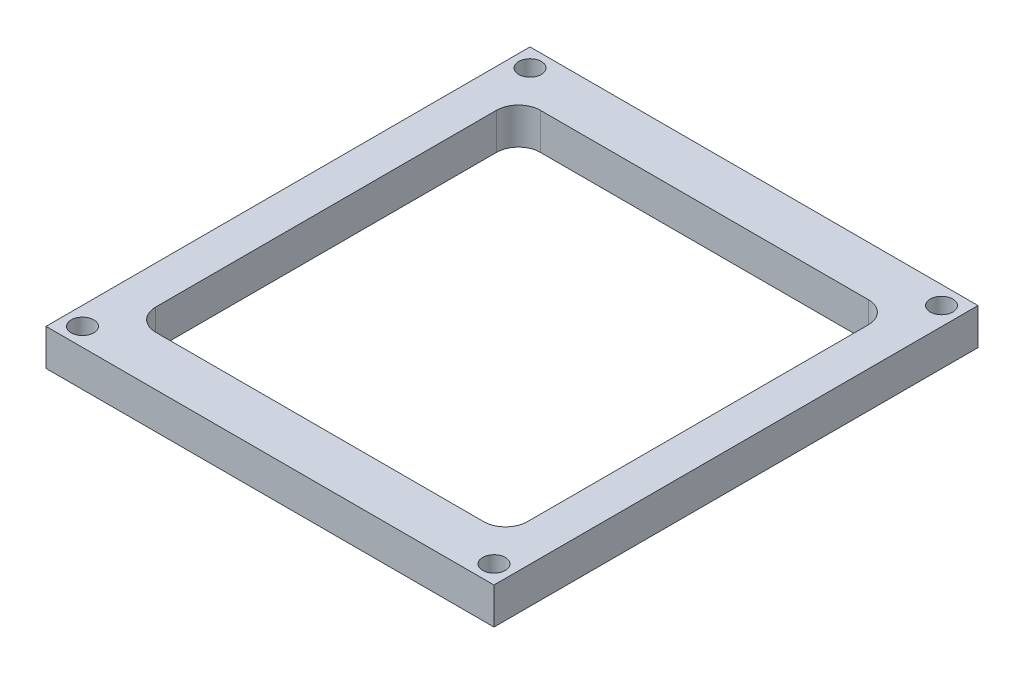
ISO-10303-21;
HEADER;
FILE_DESCRIPTION(('STEP AP214'),'2;1');
FILE_NAME('part.step','',(''),(''),'','','');
FILE_SCHEMA(('AUTOMOTIVE_DESIGN { 1 0 10303 214 1 1 1 1 }'));
ENDSEC;
DATA;
#1=APPLICATION_CONTEXT('core data for automotive mechanical design processes');
#2=APPLICATION_PROTOCOL_DEFINITION('international standard','automotive_design',2000,#1);
#3=PRODUCT_CONTEXT('',#1,'mechanical');
#4=PRODUCT('Part','Part','',(#3));
#5=PRODUCT_RELATED_PRODUCT_CATEGORY('part','',(#4));
#6=PRODUCT_DEFINITION_FORMATION('','',#4);
#7=PRODUCT_DEFINITION_CONTEXT('part definition',#1,'design');
#8=PRODUCT_DEFINITION('design','',#6,#7);
#9=PRODUCT_DEFINITION_SHAPE('','',#8);
#10=(LENGTH_UNIT() NAMED_UNIT(*) SI_UNIT(.MILLI.,.METRE.));
#11=(NAMED_UNIT(*) PLANE_ANGLE_UNIT() SI_UNIT($,.RADIAN.));
#12=(NAMED_UNIT(*) SI_UNIT($,.STERADIAN.) SOLID_ANGLE_UNIT());
#13=UNCERTAINTY_MEASURE_WITH_UNIT(LENGTH_MEASURE(1.E-05),#10,'distance_accuracy_value','');
#14=(GEOMETRIC_REPRESENTATION_CONTEXT(3) GLOBAL_UNCERTAINTY_ASSIGNED_CONTEXT((#13)) GLOBAL_UNIT_ASSIGNED_CONTEXT((#10,
#11,#12)) REPRESENTATION_CONTEXT('',''));
#15=CARTESIAN_POINT('',(0.,0.,0.));
#16=DIRECTION('',(0.,0.,1.));
#17=DIRECTION('',(1.,0.,0.));
#18=AXIS2_PLACEMENT_3D('',#15,#16,#17);
#19=CARTESIAN_POINT('',(0.,5.,0.));
#20=DIRECTION('',(0.,1.,0.));
#21=DIRECTION('',(0.,0.,1.));
#22=AXIS2_PLACEMENT_3D('',#19,#20,#21);
#23=PLANE('',#22);
#24=CARTESIAN_POINT('',(37.919215891535,5.,34.6539286300124));
#25=DIRECTION('',(0.,1.,0.));
#26=DIRECTION('',(0.,0.,1.));
#27=AXIS2_PLACEMENT_3D('',#24,#25,#26);
#28=CIRCLE('',#27,1.54999999999999);
#29=CARTESIAN_POINT('',(37.919215891535,5.,36.2039286300124));
#30=VERTEX_POINT('',#29);
#31=EDGE_CURVE('E199',#30,#30,#28,.T.);
#32=ORIENTED_EDGE('',*,*,#31,.F.);
#33=EDGE_LOOP('',(#32));
#34=FACE_BOUND('',#33,.T.);
#35=CARTESIAN_POINT('',(-18.480784108465,5.,-26.6860713699876));
#36=DIRECTION('',(0.,1.,0.));
#37=DIRECTION('',(0.,0.,1.));
#38=AXIS2_PLACEMENT_3D('',#35,#36,#37);
#39=CIRCLE('',#38,1.55);
#40=CARTESIAN_POINT('',(-18.480784108465,5.,-25.1360713699877));
#41=VERTEX_POINT('',#40);
#42=EDGE_CURVE('E211',#41,#41,#39,.T.);
#43=ORIENTED_EDGE('',*,*,#42,.F.);
#44=EDGE_LOOP('',(#43));
#45=FACE_BOUND('',#44,.T.);
#46=DIRECTION('',(0.,0.,1.));
#47=VECTOR('',#46,1.);
#48=CARTESIAN_POINT('',(-20.980784108465,5.,-29.1860713699876));
#49=LINE('',#48,#47);
#50=CARTESIAN_POINT('',(-20.980784108465,5.,-29.1860713699876));
#51=VERTEX_POINT('',#50);
#52=CARTESIAN_POINT('',(-20.980784108465,5.,37.1539286300124));
#53=VERTEX_POINT('',#52);
#54=EDGE_CURVE('E217',#51,#53,#49,.T.);
#55=ORIENTED_EDGE('',*,*,#54,.T.);
#56=DIRECTION('',(1.,0.,0.));
#57=VECTOR('',#56,1.);
#58=CARTESIAN_POINT('',(-20.980784108465,5.,37.1539286300124));
#59=LINE('',#58,#57);
#60=CARTESIAN_POINT('',(40.419215891535,5.,37.1539286300124));
#61=VERTEX_POINT('',#60);
#62=EDGE_CURVE('E220',#53,#61,#59,.T.);
#63=ORIENTED_EDGE('',*,*,#62,.T.);
#64=DIRECTION('',(0.,0.,-1.));
#65=VECTOR('',#64,1.);
#66=CARTESIAN_POINT('',(40.419215891535,5.,-29.1860713699877));
#67=LINE('',#66,#65);
#68=CARTESIAN_POINT('',(40.419215891535,5.,-29.1860713699877));
#69=VERTEX_POINT('',#68);
#70=EDGE_CURVE('E223',#61,#69,#67,.T.);
#71=ORIENTED_EDGE('',*,*,#70,.T.);
#72=DIRECTION('',(-1.,0.,0.));
#73=VECTOR('',#72,1.);
#74=CARTESIAN_POINT('',(-20.980784108465,5.,-29.1860713699876));
#75=LINE('',#74,#73);
#76=EDGE_CURVE('E225',#69,#51,#75,.T.);
#77=ORIENTED_EDGE('',*,*,#76,.T.);
#78=EDGE_LOOP('',(#55,#63,#71,#77));
#79=FACE_BOUND('',#78,.T.);
#80=CARTESIAN_POINT('',(37.919215891535,5.,-26.6860713699877));
#81=DIRECTION('',(0.,1.,0.));
#82=DIRECTION('',(0.,0.,-1.));
#83=AXIS2_PLACEMENT_3D('',#80,#81,#82);
#84=CIRCLE('',#83,1.54999999999999);
#85=CARTESIAN_POINT('',(37.919215891535,5.,-28.2360713699877));
#86=VERTEX_POINT('',#85);
#87=EDGE_CURVE('E205',#86,#86,#84,.T.);
#88=ORIENTED_EDGE('',*,*,#87,.F.);
#89=EDGE_LOOP('',(#88));
#90=FACE_BOUND('',#89,.T.);
#91=CARTESIAN_POINT('',(-18.480784108465,5.,34.6539286300124));
#92=DIRECTION('',(0.,1.,0.));
#93=DIRECTION('',(0.,0.,-1.));
#94=AXIS2_PLACEMENT_3D('',#91,#92,#93);
#95=CIRCLE('',#94,1.55);
#96=CARTESIAN_POINT('',(-18.480784108465,5.,33.1039286300124));
#97=VERTEX_POINT('',#96);
#98=EDGE_CURVE('E193',#97,#97,#95,.T.);
#99=ORIENTED_EDGE('',*,*,#98,.F.);
#100=EDGE_LOOP('',(#99));
#101=FACE_BOUND('',#100,.T.);
#102=DIRECTION('',(0.,0.,-1.));
#103=VECTOR('',#102,1.);
#104=CARTESIAN_POINT('',(35.194215891535,5.,27.3389286300124));
#105=LINE('',#104,#103);
#106=CARTESIAN_POINT('',(35.194215891535,5.,27.3389286300124));
#107=VERTEX_POINT('',#106);
#108=CARTESIAN_POINT('',(35.194215891535,5.,-19.3710713699876));
#109=VERTEX_POINT('',#108);
#110=EDGE_CURVE('E136',#107,#109,#105,.T.);
#111=ORIENTED_EDGE('',*,*,#110,.F.);
#112=CARTESIAN_POINT('',(32.194215891535,5.,27.3389286300124));
#113=DIRECTION('',(0.,1.,0.));
#114=DIRECTION('',(0.,0.,1.));
#115=AXIS2_PLACEMENT_3D('',#112,#113,#114);
#116=CIRCLE('',#115,3.);
#117=CARTESIAN_POINT('',(32.194215891535,5.,30.3389286300124));
#118=VERTEX_POINT('',#117);
#119=EDGE_CURVE('E128',#118,#107,#116,.T.);
#120=ORIENTED_EDGE('',*,*,#119,.F.);
#121=DIRECTION('',(1.,0.,0.));
#122=VECTOR('',#121,1.);
#123=CARTESIAN_POINT('',(-12.755784108465,5.,30.3389286300124));
#124=LINE('',#123,#122);
#125=CARTESIAN_POINT('',(-12.755784108465,5.,30.3389286300124));
#126=VERTEX_POINT('',#125);
#127=EDGE_CURVE('E161',#126,#118,#124,.T.);
#128=ORIENTED_EDGE('',*,*,#127,.F.);
#129=CARTESIAN_POINT('',(-12.755784108465,5.,27.3389286300124));
#130=DIRECTION('',(0.,1.,0.));
#131=DIRECTION('',(0.,0.,-1.));
#132=AXIS2_PLACEMENT_3D('',#129,#130,#131);
#133=CIRCLE('',#132,3.);
#134=CARTESIAN_POINT('',(-15.755784108465,5.,27.3389286300124));
#135=VERTEX_POINT('',#134);
#136=EDGE_CURVE('E159',#135,#126,#133,.T.);
#137=ORIENTED_EDGE('',*,*,#136,.F.);
#138=DIRECTION('',(0.,0.,1.));
#139=VECTOR('',#138,1.);
#140=CARTESIAN_POINT('',(-15.755784108465,5.,27.3389286300124));
#141=LINE('',#140,#139);
#142=CARTESIAN_POINT('',(-15.755784108465,5.,-19.3710713699876));
#143=VERTEX_POINT('',#142);
#144=EDGE_CURVE('E157',#143,#135,#141,.T.);
#145=ORIENTED_EDGE('',*,*,#144,.F.);
#146=CARTESIAN_POINT('',(-12.755784108465,5.,-19.3710713699876));
#147=DIRECTION('',(0.,1.,0.));
#148=DIRECTION('',(0.,0.,-1.));
#149=AXIS2_PLACEMENT_3D('',#146,#147,#148);
#150=CIRCLE('',#149,3.);
#151=CARTESIAN_POINT('',(-12.755784108465,5.,-22.3710713699876));
#152=VERTEX_POINT('',#151);
#153=EDGE_CURVE('E155',#152,#143,#150,.T.);
#154=ORIENTED_EDGE('',*,*,#153,.F.);
#155=DIRECTION('',(-1.,0.,0.));
#156=VECTOR('',#155,1.);
#157=CARTESIAN_POINT('',(-12.755784108465,5.,-22.3710713699876));
#158=LINE('',#157,#156);
#159=CARTESIAN_POINT('',(32.194215891535,5.,-22.3710713699876));
#160=VERTEX_POINT('',#159);
#161=EDGE_CURVE('E151',#160,#152,#158,.T.);
#162=ORIENTED_EDGE('',*,*,#161,.F.);
#163=CARTESIAN_POINT('',(32.194215891535,5.,-19.3710713699876));
#164=DIRECTION('',(0.,1.,0.));
#165=DIRECTION('',(0.,0.,-1.));
#166=AXIS2_PLACEMENT_3D('',#163,#164,#165);
#167=CIRCLE('',#166,3.);
#168=EDGE_CURVE('E149',#109,#160,#167,.T.);
#169=ORIENTED_EDGE('',*,*,#168,.F.);
#170=EDGE_LOOP('',(#111,#120,#128,#137,#145,#154,#162,#169));
#171=FACE_BOUND('',#170,.T.);
#172=ADVANCED_FACE('F39',(#34,#45,#79,#90,#101,#171),#23,.T.);
#173=CARTESIAN_POINT('',(0.,0.,0.));
#174=DIRECTION('',(0.,1.,0.));
#175=DIRECTION('',(0.,0.,1.));
#176=AXIS2_PLACEMENT_3D('',#173,#174,#175);
#177=PLANE('',#176);
#178=CARTESIAN_POINT('',(-18.480784108465,0.,34.6539286300124));
#179=DIRECTION('',(0.,1.,0.));
#180=DIRECTION('',(0.,0.,-1.));
#181=AXIS2_PLACEMENT_3D('',#178,#179,#180);
#182=CIRCLE('',#181,1.55);
#183=CARTESIAN_POINT('',(-18.480784108465,0.,33.1039286300124));
#184=VERTEX_POINT('',#183);
#185=EDGE_CURVE('E144',#184,#184,#182,.T.);
#186=ORIENTED_EDGE('',*,*,#185,.T.);
#187=EDGE_LOOP('',(#186));
#188=FACE_BOUND('',#187,.T.);
#189=CARTESIAN_POINT('',(37.919215891535,0.,34.6539286300124));
#190=DIRECTION('',(0.,1.,0.));
#191=DIRECTION('',(0.,0.,1.));
#192=AXIS2_PLACEMENT_3D('',#189,#190,#191);
#193=CIRCLE('',#192,1.54999999999999);
#194=CARTESIAN_POINT('',(37.919215891535,0.,36.2039286300124));
#195=VERTEX_POINT('',#194);
#196=EDGE_CURVE('E196',#195,#195,#193,.T.);
#197=ORIENTED_EDGE('',*,*,#196,.T.);
#198=EDGE_LOOP('',(#197));
#199=FACE_BOUND('',#198,.T.);
#200=CARTESIAN_POINT('',(37.919215891535,0.,-26.6860713699877));
#201=DIRECTION('',(0.,1.,0.));
#202=DIRECTION('',(0.,0.,-1.));
#203=AXIS2_PLACEMENT_3D('',#200,#201,#202);
#204=CIRCLE('',#203,1.54999999999999);
#205=CARTESIAN_POINT('',(37.919215891535,0.,-28.2360713699877));
#206=VERTEX_POINT('',#205);
#207=EDGE_CURVE('E202',#206,#206,#204,.T.);
#208=ORIENTED_EDGE('',*,*,#207,.T.);
#209=EDGE_LOOP('',(#208));
#210=FACE_BOUND('',#209,.T.);
#211=CARTESIAN_POINT('',(-18.480784108465,0.,-26.6860713699876));
#212=DIRECTION('',(0.,1.,0.));
#213=DIRECTION('',(0.,0.,1.));
#214=AXIS2_PLACEMENT_3D('',#211,#212,#213);
#215=CIRCLE('',#214,1.55);
#216=CARTESIAN_POINT('',(-18.480784108465,0.,-25.1360713699877));
#217=VERTEX_POINT('',#216);
#218=EDGE_CURVE('E208',#217,#217,#215,.T.);
#219=ORIENTED_EDGE('',*,*,#218,.T.);
#220=EDGE_LOOP('',(#219));
#221=FACE_BOUND('',#220,.T.);
#222=DIRECTION('',(0.,0.,1.));
#223=VECTOR('',#222,1.);
#224=CARTESIAN_POINT('',(-20.980784108465,0.,-29.1860713699876));
#225=LINE('',#224,#223);
#226=CARTESIAN_POINT('',(-20.980784108465,0.,-29.1860713699876));
#227=VERTEX_POINT('',#226);
#228=CARTESIAN_POINT('',(-20.980784108465,0.,37.1539286300124));
#229=VERTEX_POINT('',#228);
#230=EDGE_CURVE('E214',#227,#229,#225,.T.);
#231=ORIENTED_EDGE('',*,*,#230,.F.);
#232=DIRECTION('',(-1.,0.,0.));
#233=VECTOR('',#232,1.);
#234=CARTESIAN_POINT('',(-20.980784108465,0.,-29.1860713699876));
#235=LINE('',#234,#233);
#236=CARTESIAN_POINT('',(40.419215891535,0.,-29.1860713699877));
#237=VERTEX_POINT('',#236);
#238=EDGE_CURVE('E221',#237,#227,#235,.T.);
#239=ORIENTED_EDGE('',*,*,#238,.F.);
#240=DIRECTION('',(0.,0.,-1.));
#241=VECTOR('',#240,1.);
#242=CARTESIAN_POINT('',(40.419215891535,0.,-29.1860713699877));
#243=LINE('',#242,#241);
#244=CARTESIAN_POINT('',(40.419215891535,0.,37.1539286300124));
#245=VERTEX_POINT('',#244);
#246=EDGE_CURVE('E232',#245,#237,#243,.T.);
#247=ORIENTED_EDGE('',*,*,#246,.F.);
#248=DIRECTION('',(1.,0.,0.));
#249=VECTOR('',#248,1.);
#250=CARTESIAN_POINT('',(-20.980784108465,0.,37.1539286300124));
#251=LINE('',#250,#249);
#252=EDGE_CURVE('E230',#229,#245,#251,.T.);
#253=ORIENTED_EDGE('',*,*,#252,.F.);
#254=EDGE_LOOP('',(#231,#239,#247,#253));
#255=FACE_BOUND('',#254,.T.);
#256=CARTESIAN_POINT('',(32.194215891535,0.,27.3389286300124));
#257=DIRECTION('',(0.,1.,0.));
#258=DIRECTION('',(0.,0.,1.));
#259=AXIS2_PLACEMENT_3D('',#256,#257,#258);
#260=CIRCLE('',#259,3.);
#261=CARTESIAN_POINT('',(32.194215891535,0.,30.3389286300124));
#262=VERTEX_POINT('',#261);
#263=CARTESIAN_POINT('',(35.194215891535,0.,27.3389286300124));
#264=VERTEX_POINT('',#263);
#265=EDGE_CURVE('E62',#262,#264,#260,.T.);
#266=ORIENTED_EDGE('',*,*,#265,.T.);
#267=DIRECTION('',(0.,0.,-1.));
#268=VECTOR('',#267,1.);
#269=CARTESIAN_POINT('',(35.194215891535,0.,27.3389286300124));
#270=LINE('',#269,#268);
#271=CARTESIAN_POINT('',(35.194215891535,0.,-19.3710713699876));
#272=VERTEX_POINT('',#271);
#273=EDGE_CURVE('E143',#264,#272,#270,.T.);
#274=ORIENTED_EDGE('',*,*,#273,.T.);
#275=CARTESIAN_POINT('',(32.194215891535,0.,-19.3710713699876));
#276=DIRECTION('',(0.,1.,0.));
#277=DIRECTION('',(0.,0.,-1.));
#278=AXIS2_PLACEMENT_3D('',#275,#276,#277);
#279=CIRCLE('',#278,3.);
#280=CARTESIAN_POINT('',(32.194215891535,0.,-22.3710713699876));
#281=VERTEX_POINT('',#280);
#282=EDGE_CURVE('E165',#272,#281,#279,.T.);
#283=ORIENTED_EDGE('',*,*,#282,.T.);
#284=DIRECTION('',(-1.,0.,0.));
#285=VECTOR('',#284,1.);
#286=CARTESIAN_POINT('',(-12.755784108465,0.,-22.3710713699876));
#287=LINE('',#286,#285);
#288=CARTESIAN_POINT('',(-12.755784108465,0.,-22.3710713699876));
#289=VERTEX_POINT('',#288);
#290=EDGE_CURVE('E168',#281,#289,#287,.T.);
#291=ORIENTED_EDGE('',*,*,#290,.T.);
#292=CARTESIAN_POINT('',(-12.755784108465,0.,-19.3710713699876));
#293=DIRECTION('',(0.,1.,0.));
#294=DIRECTION('',(0.,0.,-1.));
#295=AXIS2_PLACEMENT_3D('',#292,#293,#294);
#296=CIRCLE('',#295,3.);
#297=CARTESIAN_POINT('',(-15.755784108465,0.,-19.3710713699876));
#298=VERTEX_POINT('',#297);
#299=EDGE_CURVE('E171',#289,#298,#296,.T.);
#300=ORIENTED_EDGE('',*,*,#299,.T.);
#301=DIRECTION('',(0.,0.,1.));
#302=VECTOR('',#301,1.);
#303=CARTESIAN_POINT('',(-15.755784108465,0.,27.3389286300124));
#304=LINE('',#303,#302);
#305=CARTESIAN_POINT('',(-15.755784108465,0.,27.3389286300124));
#306=VERTEX_POINT('',#305);
#307=EDGE_CURVE('E174',#298,#306,#304,.T.);
#308=ORIENTED_EDGE('',*,*,#307,.T.);
#309=CARTESIAN_POINT('',(-12.755784108465,0.,27.3389286300124));
#310=DIRECTION('',(0.,1.,0.));
#311=DIRECTION('',(0.,0.,-1.));
#312=AXIS2_PLACEMENT_3D('',#309,#310,#311);
#313=CIRCLE('',#312,3.);
#314=CARTESIAN_POINT('',(-12.755784108465,0.,30.3389286300124));
#315=VERTEX_POINT('',#314);
#316=EDGE_CURVE('E177',#306,#315,#313,.T.);
#317=ORIENTED_EDGE('',*,*,#316,.T.);
#318=DIRECTION('',(1.,0.,0.));
#319=VECTOR('',#318,1.);
#320=CARTESIAN_POINT('',(-12.755784108465,0.,30.3389286300124));
#321=LINE('',#320,#319);
#322=EDGE_CURVE('E137',#315,#262,#321,.T.);
#323=ORIENTED_EDGE('',*,*,#322,.T.);
#324=EDGE_LOOP('',(#266,#274,#283,#291,#300,#308,#317,#323));
#325=FACE_BOUND('',#324,.T.);
#326=ADVANCED_FACE('F250',(#188,#199,#210,#221,#255,#325),#177,.F.);
#327=CARTESIAN_POINT('',(-20.980784108465,5.,-29.1860713699876));
#328=DIRECTION('',(1.,0.,0.));
#329=DIRECTION('',(0.,0.,-1.));
#330=AXIS2_PLACEMENT_3D('',#327,#328,#329);
#331=PLANE('',#330);
#332=ORIENTED_EDGE('',*,*,#230,.T.);
#333=DIRECTION('',(0.,-1.,0.));
#334=VECTOR('',#333,1.);
#335=CARTESIAN_POINT('',(-20.980784108465,5.,37.1539286300124));
#336=LINE('',#335,#334);
#337=EDGE_CURVE('E11',#53,#229,#336,.T.);
#338=ORIENTED_EDGE('',*,*,#337,.F.);
#339=ORIENTED_EDGE('',*,*,#54,.F.);
#340=DIRECTION('',(0.,-1.,0.));
#341=VECTOR('',#340,1.);
#342=CARTESIAN_POINT('',(-20.980784108465,5.,-29.1860713699876));
#343=LINE('',#342,#341);
#344=EDGE_CURVE('E227',#51,#227,#343,.T.);
#345=ORIENTED_EDGE('',*,*,#344,.T.);
#346=EDGE_LOOP('',(#332,#338,#339,#345));
#347=FACE_BOUND('',#346,.T.);
#348=ADVANCED_FACE('F41',(#347),#331,.F.);
#349=CARTESIAN_POINT('',(-20.980784108465,5.,37.1539286300124));
#350=DIRECTION('',(0.,0.,-1.));
#351=DIRECTION('',(-1.,0.,0.));
#352=AXIS2_PLACEMENT_3D('',#349,#350,#351);
#353=PLANE('',#352);
#354=ORIENTED_EDGE('',*,*,#252,.T.);
#355=DIRECTION('',(0.,-1.,0.));
#356=VECTOR('',#355,1.);
#357=CARTESIAN_POINT('',(40.419215891535,5.,37.1539286300124));
#358=LINE('',#357,#356);
#359=EDGE_CURVE('E47',#61,#245,#358,.T.);
#360=ORIENTED_EDGE('',*,*,#359,.F.);
#361=ORIENTED_EDGE('',*,*,#62,.F.);
#362=ORIENTED_EDGE('',*,*,#337,.T.);
#363=EDGE_LOOP('',(#354,#360,#361,#362));
#364=FACE_BOUND('',#363,.T.);
#365=ADVANCED_FACE('F261',(#364),#353,.F.);
#366=CARTESIAN_POINT('',(40.419215891535,5.,-29.1860713699877));
#367=DIRECTION('',(-1.,0.,0.));
#368=DIRECTION('',(0.,0.,1.));
#369=AXIS2_PLACEMENT_3D('',#366,#367,#368);
#370=PLANE('',#369);
#371=ORIENTED_EDGE('',*,*,#246,.T.);
#372=DIRECTION('',(0.,-1.,0.));
#373=VECTOR('',#372,1.);
#374=CARTESIAN_POINT('',(40.419215891535,5.,-29.1860713699877));
#375=LINE('',#374,#373);
#376=EDGE_CURVE('E237',#69,#237,#375,.T.);
#377=ORIENTED_EDGE('',*,*,#376,.F.);
#378=ORIENTED_EDGE('',*,*,#70,.F.);
#379=ORIENTED_EDGE('',*,*,#359,.T.);
#380=EDGE_LOOP('',(#371,#377,#378,#379));
#381=FACE_BOUND('',#380,.T.);
#382=ADVANCED_FACE('F244',(#381),#370,.F.);
#383=CARTESIAN_POINT('',(-20.980784108465,5.,-29.1860713699876));
#384=DIRECTION('',(0.,0.,1.));
#385=DIRECTION('',(1.,0.,0.));
#386=AXIS2_PLACEMENT_3D('',#383,#384,#385);
#387=PLANE('',#386);
#388=ORIENTED_EDGE('',*,*,#238,.T.);
#389=ORIENTED_EDGE('',*,*,#344,.F.);
#390=ORIENTED_EDGE('',*,*,#76,.F.);
#391=ORIENTED_EDGE('',*,*,#376,.T.);
#392=EDGE_LOOP('',(#388,#389,#390,#391));
#393=FACE_BOUND('',#392,.T.);
#394=ADVANCED_FACE('F254',(#393),#387,.F.);
#395=CARTESIAN_POINT('',(-18.480784108465,5.,-26.6860713699876));
#396=DIRECTION('',(0.,-1.,0.));
#397=DIRECTION('',(0.,0.,-1.));
#398=AXIS2_PLACEMENT_3D('',#395,#396,#397);
#399=CYLINDRICAL_SURFACE('',#398,1.55);
#400=ORIENTED_EDGE('',*,*,#42,.T.);
#401=EDGE_LOOP('',(#400));
#402=FACE_BOUND('',#401,.T.);
#403=ORIENTED_EDGE('',*,*,#218,.F.);
#404=EDGE_LOOP('',(#403));
#405=FACE_BOUND('',#404,.T.);
#406=ADVANCED_FACE('F279',(#402,#405),#399,.F.);
#407=CARTESIAN_POINT('',(37.919215891535,5.,-26.6860713699877));
#408=DIRECTION('',(0.,-1.,0.));
#409=DIRECTION('',(0.,0.,-1.));
#410=AXIS2_PLACEMENT_3D('',#407,#408,#409);
#411=CYLINDRICAL_SURFACE('',#410,1.54999999999999);
#412=ORIENTED_EDGE('',*,*,#87,.T.);
#413=EDGE_LOOP('',(#412));
#414=FACE_BOUND('',#413,.T.);
#415=ORIENTED_EDGE('',*,*,#207,.F.);
#416=EDGE_LOOP('',(#415));
#417=FACE_BOUND('',#416,.T.);
#418=ADVANCED_FACE('F286',(#414,#417),#411,.F.);
#419=CARTESIAN_POINT('',(37.919215891535,5.,34.6539286300124));
#420=DIRECTION('',(0.,-1.,0.));
#421=DIRECTION('',(0.,0.,-1.));
#422=AXIS2_PLACEMENT_3D('',#419,#420,#421);
#423=CYLINDRICAL_SURFACE('',#422,1.54999999999999);
#424=ORIENTED_EDGE('',*,*,#31,.T.);
#425=EDGE_LOOP('',(#424));
#426=FACE_BOUND('',#425,.T.);
#427=ORIENTED_EDGE('',*,*,#196,.F.);
#428=EDGE_LOOP('',(#427));
#429=FACE_BOUND('',#428,.T.);
#430=ADVANCED_FACE('F291',(#426,#429),#423,.F.);
#431=CARTESIAN_POINT('',(-18.480784108465,5.,34.6539286300124));
#432=DIRECTION('',(0.,-1.,0.));
#433=DIRECTION('',(0.,0.,-1.));
#434=AXIS2_PLACEMENT_3D('',#431,#432,#433);
#435=CYLINDRICAL_SURFACE('',#434,1.55);
#436=ORIENTED_EDGE('',*,*,#98,.T.);
#437=EDGE_LOOP('',(#436));
#438=FACE_BOUND('',#437,.T.);
#439=ORIENTED_EDGE('',*,*,#185,.F.);
#440=EDGE_LOOP('',(#439));
#441=FACE_BOUND('',#440,.T.);
#442=ADVANCED_FACE('F300',(#438,#441),#435,.F.);
#443=CARTESIAN_POINT('',(32.194215891535,5.,27.3389286300124));
#444=DIRECTION('',(0.,-1.,0.));
#445=DIRECTION('',(0.,0.,-1.));
#446=AXIS2_PLACEMENT_3D('',#443,#444,#445);
#447=CYLINDRICAL_SURFACE('',#446,3.);
#448=ORIENTED_EDGE('',*,*,#265,.F.);
#449=DIRECTION('',(0.,-1.,0.));
#450=VECTOR('',#449,1.);
#451=CARTESIAN_POINT('',(32.194215891535,5.,30.3389286300124));
#452=LINE('',#451,#450);
#453=EDGE_CURVE('E132',#118,#262,#452,.T.);
#454=ORIENTED_EDGE('',*,*,#453,.F.);
#455=ORIENTED_EDGE('',*,*,#119,.T.);
#456=DIRECTION('',(0.,-1.,0.));
#457=VECTOR('',#456,1.);
#458=CARTESIAN_POINT('',(35.194215891535,5.,27.3389286300124));
#459=LINE('',#458,#457);
#460=EDGE_CURVE('E131',#107,#264,#459,.T.);
#461=ORIENTED_EDGE('',*,*,#460,.T.);
#462=EDGE_LOOP('',(#448,#454,#455,#461));
#463=FACE_BOUND('',#462,.T.);
#464=ADVANCED_FACE('F130',(#463),#447,.F.);
#465=CARTESIAN_POINT('',(35.194215891535,5.,27.3389286300124));
#466=DIRECTION('',(-1.,0.,0.));
#467=DIRECTION('',(0.,0.,1.));
#468=AXIS2_PLACEMENT_3D('',#465,#466,#467);
#469=PLANE('',#468);
#470=ORIENTED_EDGE('',*,*,#273,.F.);
#471=ORIENTED_EDGE('',*,*,#460,.F.);
#472=ORIENTED_EDGE('',*,*,#110,.T.);
#473=DIRECTION('',(0.,-1.,0.));
#474=VECTOR('',#473,1.);
#475=CARTESIAN_POINT('',(35.194215891535,5.,-19.3710713699876));
#476=LINE('',#475,#474);
#477=EDGE_CURVE('E145',#109,#272,#476,.T.);
#478=ORIENTED_EDGE('',*,*,#477,.T.);
#479=EDGE_LOOP('',(#470,#471,#472,#478));
#480=FACE_BOUND('',#479,.T.);
#481=ADVANCED_FACE('F140',(#480),#469,.T.);
#482=CARTESIAN_POINT('',(32.194215891535,5.,-19.3710713699876));
#483=DIRECTION('',(0.,-1.,0.));
#484=DIRECTION('',(0.,0.,-1.));
#485=AXIS2_PLACEMENT_3D('',#482,#483,#484);
#486=CYLINDRICAL_SURFACE('',#485,3.);
#487=ORIENTED_EDGE('',*,*,#282,.F.);
#488=ORIENTED_EDGE('',*,*,#477,.F.);
#489=ORIENTED_EDGE('',*,*,#168,.T.);
#490=DIRECTION('',(0.,-1.,0.));
#491=VECTOR('',#490,1.);
#492=CARTESIAN_POINT('',(32.194215891535,5.,-22.3710713699876));
#493=LINE('',#492,#491);
#494=EDGE_CURVE('E190',#160,#281,#493,.T.);
#495=ORIENTED_EDGE('',*,*,#494,.T.);
#496=EDGE_LOOP('',(#487,#488,#489,#495));
#497=FACE_BOUND('',#496,.T.);
#498=ADVANCED_FACE('F312',(#497),#486,.F.);
#499=CARTESIAN_POINT('',(-12.755784108465,5.,-22.3710713699876));
#500=DIRECTION('',(0.,0.,1.));
#501=DIRECTION('',(1.,0.,0.));
#502=AXIS2_PLACEMENT_3D('',#499,#500,#501);
#503=PLANE('',#502);
#504=ORIENTED_EDGE('',*,*,#290,.F.);
#505=ORIENTED_EDGE('',*,*,#494,.F.);
#506=ORIENTED_EDGE('',*,*,#161,.T.);
#507=DIRECTION('',(0.,-1.,0.));
#508=VECTOR('',#507,1.);
#509=CARTESIAN_POINT('',(-12.755784108465,5.,-22.3710713699876));
#510=LINE('',#509,#508);
#511=EDGE_CURVE('E188',#152,#289,#510,.T.);
#512=ORIENTED_EDGE('',*,*,#511,.T.);
#513=EDGE_LOOP('',(#504,#505,#506,#512));
#514=FACE_BOUND('',#513,.T.);
#515=ADVANCED_FACE('F315',(#514),#503,.T.);
#516=CARTESIAN_POINT('',(-12.755784108465,5.,-19.3710713699876));
#517=DIRECTION('',(0.,-1.,0.));
#518=DIRECTION('',(0.,0.,-1.));
#519=AXIS2_PLACEMENT_3D('',#516,#517,#518);
#520=CYLINDRICAL_SURFACE('',#519,3.);
#521=ORIENTED_EDGE('',*,*,#299,.F.);
#522=ORIENTED_EDGE('',*,*,#511,.F.);
#523=ORIENTED_EDGE('',*,*,#153,.T.);
#524=DIRECTION('',(0.,-1.,0.));
#525=VECTOR('',#524,1.);
#526=CARTESIAN_POINT('',(-15.755784108465,5.,-19.3710713699876));
#527=LINE('',#526,#525);
#528=EDGE_CURVE('E186',#143,#298,#527,.T.);
#529=ORIENTED_EDGE('',*,*,#528,.T.);
#530=EDGE_LOOP('',(#521,#522,#523,#529));
#531=FACE_BOUND('',#530,.T.);
#532=ADVANCED_FACE('F319',(#531),#520,.F.);
#533=CARTESIAN_POINT('',(-15.755784108465,5.,27.3389286300124));
#534=DIRECTION('',(1.,0.,0.));
#535=DIRECTION('',(0.,0.,-1.));
#536=AXIS2_PLACEMENT_3D('',#533,#534,#535);
#537=PLANE('',#536);
#538=ORIENTED_EDGE('',*,*,#307,.F.);
#539=ORIENTED_EDGE('',*,*,#528,.F.);
#540=ORIENTED_EDGE('',*,*,#144,.T.);
#541=DIRECTION('',(0.,-1.,0.));
#542=VECTOR('',#541,1.);
#543=CARTESIAN_POINT('',(-15.755784108465,5.,27.3389286300124));
#544=LINE('',#543,#542);
#545=EDGE_CURVE('E184',#135,#306,#544,.T.);
#546=ORIENTED_EDGE('',*,*,#545,.T.);
#547=EDGE_LOOP('',(#538,#539,#540,#546));
#548=FACE_BOUND('',#547,.T.);
#549=ADVANCED_FACE('F323',(#548),#537,.T.);
#550=CARTESIAN_POINT('',(-12.755784108465,5.,27.3389286300124));
#551=DIRECTION('',(0.,-1.,0.));
#552=DIRECTION('',(0.,0.,-1.));
#553=AXIS2_PLACEMENT_3D('',#550,#551,#552);
#554=CYLINDRICAL_SURFACE('',#553,3.);
#555=ORIENTED_EDGE('',*,*,#316,.F.);
#556=ORIENTED_EDGE('',*,*,#545,.F.);
#557=ORIENTED_EDGE('',*,*,#136,.T.);
#558=DIRECTION('',(0.,-1.,0.));
#559=VECTOR('',#558,1.);
#560=CARTESIAN_POINT('',(-12.755784108465,5.,30.3389286300124));
#561=LINE('',#560,#559);
#562=EDGE_CURVE('E54',#126,#315,#561,.T.);
#563=ORIENTED_EDGE('',*,*,#562,.T.);
#564=EDGE_LOOP('',(#555,#556,#557,#563));
#565=FACE_BOUND('',#564,.T.);
#566=ADVANCED_FACE('F327',(#565),#554,.F.);
#567=CARTESIAN_POINT('',(-12.755784108465,5.,30.3389286300124));
#568=DIRECTION('',(0.,0.,-1.));
#569=DIRECTION('',(-1.,0.,0.));
#570=AXIS2_PLACEMENT_3D('',#567,#568,#569);
#571=PLANE('',#570);
#572=ORIENTED_EDGE('',*,*,#322,.F.);
#573=ORIENTED_EDGE('',*,*,#562,.F.);
#574=ORIENTED_EDGE('',*,*,#127,.T.);
#575=ORIENTED_EDGE('',*,*,#453,.T.);
#576=EDGE_LOOP('',(#572,#573,#574,#575));
#577=FACE_BOUND('',#576,.T.);
#578=ADVANCED_FACE('F331',(#577),#571,.T.);
#579=CLOSED_SHELL('',(#172,#326,#348,#365,#382,#394,#406,#418,#430,#442,#464,#481,#498,#515,
#532,#549,#566,#578));
#580=MANIFOLD_SOLID_BREP('B2',#579);
#581=ADVANCED_BREP_SHAPE_REPRESENTATION('',(#18,#580),#14);
#582=SHAPE_DEFINITION_REPRESENTATION(#9,#581);
ENDSEC;
END-ISO-10303-21;
